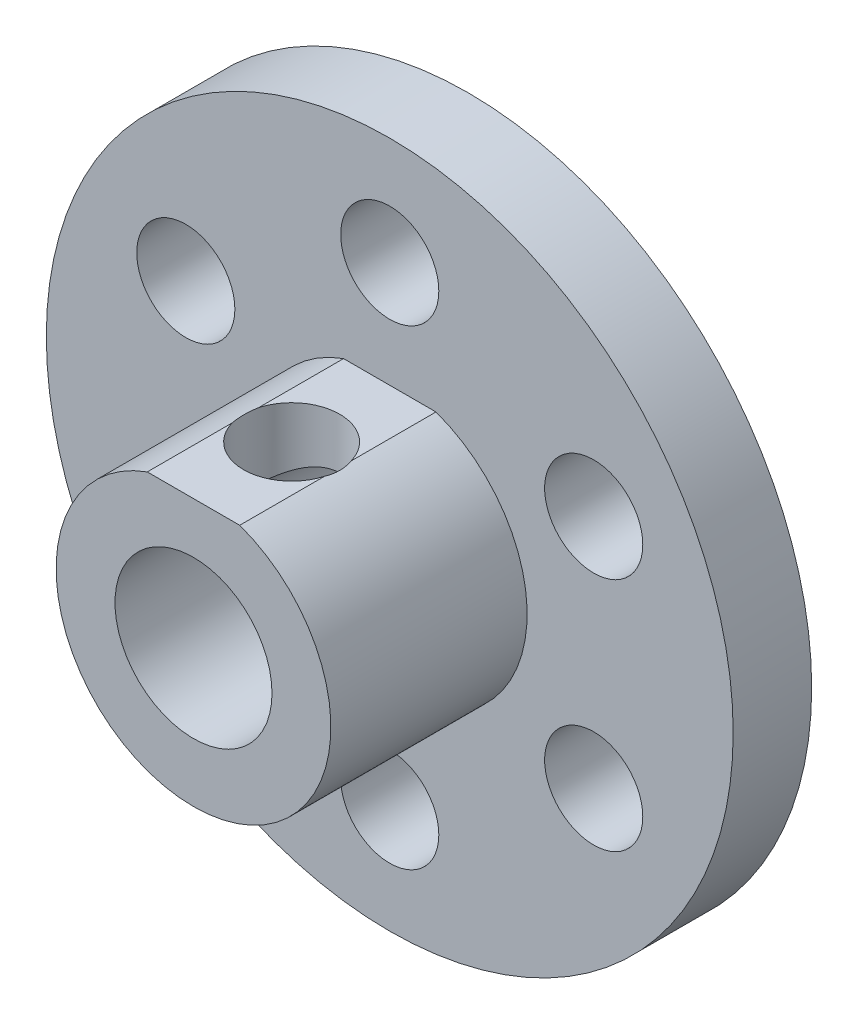
ISO-10303-21;
HEADER;
FILE_DESCRIPTION(('STEP AP214'),'2;1');
FILE_NAME('part.step','',(''),(''),'','','');
FILE_SCHEMA(('AUTOMOTIVE_DESIGN { 1 0 10303 214 1 1 1 1 }'));
ENDSEC;
DATA;
#1=APPLICATION_CONTEXT('core data for automotive mechanical design processes');
#2=APPLICATION_PROTOCOL_DEFINITION('international standard','automotive_design',2000,#1);
#3=PRODUCT_CONTEXT('',#1,'mechanical');
#4=PRODUCT('Part','Part','',(#3));
#5=PRODUCT_RELATED_PRODUCT_CATEGORY('part','',(#4));
#6=PRODUCT_DEFINITION_FORMATION('','',#4);
#7=PRODUCT_DEFINITION_CONTEXT('part definition',#1,'design');
#8=PRODUCT_DEFINITION('design','',#6,#7);
#9=PRODUCT_DEFINITION_SHAPE('','',#8);
#10=(LENGTH_UNIT() NAMED_UNIT(*) SI_UNIT(.MILLI.,.METRE.));
#11=(NAMED_UNIT(*) PLANE_ANGLE_UNIT() SI_UNIT($,.RADIAN.));
#12=(NAMED_UNIT(*) SI_UNIT($,.STERADIAN.) SOLID_ANGLE_UNIT());
#13=UNCERTAINTY_MEASURE_WITH_UNIT(LENGTH_MEASURE(1.E-05),#10,'distance_accuracy_value','');
#14=(GEOMETRIC_REPRESENTATION_CONTEXT(3) GLOBAL_UNCERTAINTY_ASSIGNED_CONTEXT((#13)) GLOBAL_UNIT_ASSIGNED_CONTEXT((#10,
#11,#12)) REPRESENTATION_CONTEXT('',''));
#15=CARTESIAN_POINT('',(0.,0.,0.));
#16=DIRECTION('',(0.,0.,1.));
#17=DIRECTION('',(1.,0.,0.));
#18=AXIS2_PLACEMENT_3D('',#15,#16,#17);
#19=CARTESIAN_POINT('',(2.35510577368301,6.59192512053687,14.));
#20=DIRECTION('',(0.,-1.,0.));
#21=DIRECTION('',(0.,0.,-1.));
#22=AXIS2_PLACEMENT_3D('',#19,#20,#21);
#23=PLANE('',#22);
#24=DIRECTION('',(0.,0.,-1.));
#25=VECTOR('',#24,1.);
#26=CARTESIAN_POINT('',(2.35510577368301,6.59192512053687,14.));
#27=LINE('',#26,#25);
#28=CARTESIAN_POINT('',(2.35510577368301,6.59192512053687,14.));
#29=VERTEX_POINT('',#28);
#30=CARTESIAN_POINT('',(2.35510577368301,6.59192512053687,9.67526053843311));
#31=VERTEX_POINT('',#30);
#32=EDGE_CURVE('E90',#29,#31,#27,.T.);
#33=ORIENTED_EDGE('',*,*,#32,.T.);
#34=CARTESIAN_POINT('',(0.,6.59192512053687,9.));
#35=DIRECTION('',(0.,-1.,0.));
#36=DIRECTION('',(0.,0.,-1.));
#37=AXIS2_PLACEMENT_3D('',#34,#35,#36);
#38=CIRCLE('',#37,2.45);
#39=CARTESIAN_POINT('',(-2.35510577368301,6.59192512053687,9.67526053843311));
#40=VERTEX_POINT('',#39);
#41=EDGE_CURVE('E11',#31,#40,#38,.T.);
#42=ORIENTED_EDGE('',*,*,#41,.T.);
#43=DIRECTION('',(0.,0.,-1.));
#44=VECTOR('',#43,1.);
#45=CARTESIAN_POINT('',(-2.35510577368301,6.59192512053687,14.));
#46=LINE('',#45,#44);
#47=CARTESIAN_POINT('',(-2.35510577368301,6.59192512053687,14.));
#48=VERTEX_POINT('',#47);
#49=EDGE_CURVE('E103',#48,#40,#46,.T.);
#50=ORIENTED_EDGE('',*,*,#49,.F.);
#51=DIRECTION('',(-1.,0.,0.));
#52=VECTOR('',#51,1.);
#53=CARTESIAN_POINT('',(2.35510577368301,6.59192512053687,14.));
#54=LINE('',#53,#52);
#55=EDGE_CURVE('E93',#29,#48,#54,.T.);
#56=ORIENTED_EDGE('',*,*,#55,.F.);
#57=EDGE_LOOP('',(#33,#42,#50,#56));
#58=FACE_BOUND('',#57,.T.);
#59=ADVANCED_FACE('F39',(#58),#23,.F.);
#60=CARTESIAN_POINT('',(0.,0.,4.));
#61=DIRECTION('',(0.,0.,1.));
#62=DIRECTION('',(1.,0.,0.));
#63=AXIS2_PLACEMENT_3D('',#60,#61,#62);
#64=PLANE('',#63);
#65=CARTESIAN_POINT('',(-10.3923048454133,6.,4.));
#66=DIRECTION('',(0.,0.,1.));
#67=DIRECTION('',(1.,0.,0.));
#68=AXIS2_PLACEMENT_3D('',#65,#66,#67);
#69=CIRCLE('',#68,2.5);
#70=CARTESIAN_POINT('',(-7.89230484541326,6.,4.));
#71=VERTEX_POINT('',#70);
#72=EDGE_CURVE('E101',#71,#71,#69,.T.);
#73=ORIENTED_EDGE('',*,*,#72,.F.);
#74=EDGE_LOOP('',(#73));
#75=FACE_BOUND('',#74,.T.);
#76=CARTESIAN_POINT('',(0.,-12.,4.));
#77=DIRECTION('',(0.,0.,1.));
#78=DIRECTION('',(1.,0.,0.));
#79=AXIS2_PLACEMENT_3D('',#76,#77,#78);
#80=CIRCLE('',#79,2.5);
#81=CARTESIAN_POINT('',(2.5,-12.,4.));
#82=VERTEX_POINT('',#81);
#83=EDGE_CURVE('E119',#82,#82,#80,.T.);
#84=ORIENTED_EDGE('',*,*,#83,.F.);
#85=EDGE_LOOP('',(#84));
#86=FACE_BOUND('',#85,.T.);
#87=CARTESIAN_POINT('',(10.3923048454133,6.,4.));
#88=DIRECTION('',(0.,0.,1.));
#89=DIRECTION('',(1.,0.,0.));
#90=AXIS2_PLACEMENT_3D('',#87,#88,#89);
#91=CIRCLE('',#90,2.50000000000003);
#92=CARTESIAN_POINT('',(12.8923048454133,6.,4.));
#93=VERTEX_POINT('',#92);
#94=EDGE_CURVE('E135',#93,#93,#91,.T.);
#95=ORIENTED_EDGE('',*,*,#94,.F.);
#96=EDGE_LOOP('',(#95));
#97=FACE_BOUND('',#96,.T.);
#98=CARTESIAN_POINT('',(0.,12.,4.));
#99=DIRECTION('',(0.,0.,1.));
#100=DIRECTION('',(1.,0.,0.));
#101=AXIS2_PLACEMENT_3D('',#98,#99,#100);
#102=CIRCLE('',#101,2.5);
#103=CARTESIAN_POINT('',(2.50000000000001,12.,4.));
#104=VERTEX_POINT('',#103);
#105=EDGE_CURVE('E147',#104,#104,#102,.T.);
#106=ORIENTED_EDGE('',*,*,#105,.F.);
#107=EDGE_LOOP('',(#106));
#108=FACE_BOUND('',#107,.T.);
#109=CARTESIAN_POINT('',(0.,0.,4.));
#110=DIRECTION('',(0.,0.,1.));
#111=DIRECTION('',(1.,0.,0.));
#112=AXIS2_PLACEMENT_3D('',#109,#110,#111);
#113=CIRCLE('',#112,17.5);
#114=CARTESIAN_POINT('',(17.5,0.,4.));
#115=VERTEX_POINT('',#114);
#116=EDGE_CURVE('E155',#115,#115,#113,.T.);
#117=ORIENTED_EDGE('',*,*,#116,.T.);
#118=EDGE_LOOP('',(#117));
#119=FACE_BOUND('',#118,.T.);
#120=CARTESIAN_POINT('',(10.3923048454133,-6.,4.));
#121=DIRECTION('',(0.,0.,1.));
#122=DIRECTION('',(1.,0.,0.));
#123=AXIS2_PLACEMENT_3D('',#120,#121,#122);
#124=CIRCLE('',#123,2.50000000000005);
#125=CARTESIAN_POINT('',(12.8923048454133,-6.,4.));
#126=VERTEX_POINT('',#125);
#127=EDGE_CURVE('E127',#126,#126,#124,.T.);
#128=ORIENTED_EDGE('',*,*,#127,.F.);
#129=EDGE_LOOP('',(#128));
#130=FACE_BOUND('',#129,.T.);
#131=CARTESIAN_POINT('',(-10.3923048454133,-6.,4.));
#132=DIRECTION('',(0.,0.,1.));
#133=DIRECTION('',(1.,0.,0.));
#134=AXIS2_PLACEMENT_3D('',#131,#132,#133);
#135=CIRCLE('',#134,2.5);
#136=CARTESIAN_POINT('',(-7.89230484541326,-6.,4.));
#137=VERTEX_POINT('',#136);
#138=EDGE_CURVE('E111',#137,#137,#135,.T.);
#139=ORIENTED_EDGE('',*,*,#138,.F.);
#140=EDGE_LOOP('',(#139));
#141=FACE_BOUND('',#140,.T.);
#142=DIRECTION('',(-1.,0.,0.));
#143=VECTOR('',#142,1.);
#144=CARTESIAN_POINT('',(2.35510577368301,6.59192512053687,4.));
#145=LINE('',#144,#143);
#146=CARTESIAN_POINT('',(2.35510577368301,6.59192512053687,4.));
#147=VERTEX_POINT('',#146);
#148=CARTESIAN_POINT('',(-2.35510577368301,6.59192512053687,4.));
#149=VERTEX_POINT('',#148);
#150=EDGE_CURVE('E215',#147,#149,#145,.T.);
#151=ORIENTED_EDGE('',*,*,#150,.F.);
#152=CARTESIAN_POINT('',(0.,0.,4.));
#153=DIRECTION('',(0.,0.,1.));
#154=DIRECTION('',(1.,0.,0.));
#155=AXIS2_PLACEMENT_3D('',#152,#153,#154);
#156=CIRCLE('',#155,7.);
#157=EDGE_CURVE('E226',#149,#147,#156,.T.);
#158=ORIENTED_EDGE('',*,*,#157,.F.);
#159=EDGE_LOOP('',(#151,#158));
#160=FACE_BOUND('',#159,.T.);
#161=ADVANCED_FACE('F166',(#75,#86,#97,#108,#119,#130,#141,#160),#64,.T.);
#162=CARTESIAN_POINT('',(0.,0.,0.));
#163=DIRECTION('',(0.,0.,1.));
#164=DIRECTION('',(1.,0.,0.));
#165=AXIS2_PLACEMENT_3D('',#162,#163,#164);
#166=PLANE('',#165);
#167=CARTESIAN_POINT('',(0.,0.,0.));
#168=DIRECTION('',(0.,0.,1.));
#169=DIRECTION('',(1.,0.,0.));
#170=AXIS2_PLACEMENT_3D('',#167,#168,#169);
#171=CIRCLE('',#170,17.5);
#172=CARTESIAN_POINT('',(17.5,0.,0.));
#173=VERTEX_POINT('',#172);
#174=EDGE_CURVE('E151',#173,#173,#171,.T.);
#175=ORIENTED_EDGE('',*,*,#174,.F.);
#176=EDGE_LOOP('',(#175));
#177=FACE_BOUND('',#176,.T.);
#178=CARTESIAN_POINT('',(0.,12.,0.));
#179=DIRECTION('',(0.,0.,1.));
#180=DIRECTION('',(1.,0.,0.));
#181=AXIS2_PLACEMENT_3D('',#178,#179,#180);
#182=CIRCLE('',#181,2.5);
#183=CARTESIAN_POINT('',(2.50000000000001,12.,0.));
#184=VERTEX_POINT('',#183);
#185=EDGE_CURVE('E146',#184,#184,#182,.T.);
#186=ORIENTED_EDGE('',*,*,#185,.T.);
#187=EDGE_LOOP('',(#186));
#188=FACE_BOUND('',#187,.T.);
#189=CARTESIAN_POINT('',(0.,0.,0.));
#190=DIRECTION('',(0.,0.,1.));
#191=DIRECTION('',(1.,0.,0.));
#192=AXIS2_PLACEMENT_3D('',#189,#190,#191);
#193=CIRCLE('',#192,4.);
#194=CARTESIAN_POINT('',(4.,0.,0.));
#195=VERTEX_POINT('',#194);
#196=EDGE_CURVE('E139',#195,#195,#193,.T.);
#197=ORIENTED_EDGE('',*,*,#196,.T.);
#198=EDGE_LOOP('',(#197));
#199=FACE_BOUND('',#198,.T.);
#200=CARTESIAN_POINT('',(10.3923048454133,6.,0.));
#201=DIRECTION('',(0.,0.,1.));
#202=DIRECTION('',(1.,0.,0.));
#203=AXIS2_PLACEMENT_3D('',#200,#201,#202);
#204=CIRCLE('',#203,2.50000000000003);
#205=CARTESIAN_POINT('',(12.8923048454133,6.,0.));
#206=VERTEX_POINT('',#205);
#207=EDGE_CURVE('E131',#206,#206,#204,.T.);
#208=ORIENTED_EDGE('',*,*,#207,.T.);
#209=EDGE_LOOP('',(#208));
#210=FACE_BOUND('',#209,.T.);
#211=CARTESIAN_POINT('',(10.3923048454133,-6.,0.));
#212=DIRECTION('',(0.,0.,1.));
#213=DIRECTION('',(1.,0.,0.));
#214=AXIS2_PLACEMENT_3D('',#211,#212,#213);
#215=CIRCLE('',#214,2.50000000000005);
#216=CARTESIAN_POINT('',(12.8923048454133,-6.,0.));
#217=VERTEX_POINT('',#216);
#218=EDGE_CURVE('E123',#217,#217,#215,.T.);
#219=ORIENTED_EDGE('',*,*,#218,.T.);
#220=EDGE_LOOP('',(#219));
#221=FACE_BOUND('',#220,.T.);
#222=CARTESIAN_POINT('',(0.,-12.,0.));
#223=DIRECTION('',(0.,0.,1.));
#224=DIRECTION('',(1.,0.,0.));
#225=AXIS2_PLACEMENT_3D('',#222,#223,#224);
#226=CIRCLE('',#225,2.5);
#227=CARTESIAN_POINT('',(2.5,-12.,0.));
#228=VERTEX_POINT('',#227);
#229=EDGE_CURVE('E115',#228,#228,#226,.T.);
#230=ORIENTED_EDGE('',*,*,#229,.T.);
#231=EDGE_LOOP('',(#230));
#232=FACE_BOUND('',#231,.T.);
#233=CARTESIAN_POINT('',(-10.3923048454133,-6.,0.));
#234=DIRECTION('',(0.,0.,1.));
#235=DIRECTION('',(1.,0.,0.));
#236=AXIS2_PLACEMENT_3D('',#233,#234,#235);
#237=CIRCLE('',#236,2.5);
#238=CARTESIAN_POINT('',(-7.89230484541326,-6.,0.));
#239=VERTEX_POINT('',#238);
#240=EDGE_CURVE('E109',#239,#239,#237,.T.);
#241=ORIENTED_EDGE('',*,*,#240,.T.);
#242=EDGE_LOOP('',(#241));
#243=FACE_BOUND('',#242,.T.);
#244=CARTESIAN_POINT('',(-10.3923048454133,6.,0.));
#245=DIRECTION('',(0.,0.,1.));
#246=DIRECTION('',(1.,0.,0.));
#247=AXIS2_PLACEMENT_3D('',#244,#245,#246);
#248=CIRCLE('',#247,2.5);
#249=CARTESIAN_POINT('',(-7.89230484541326,6.,0.));
#250=VERTEX_POINT('',#249);
#251=EDGE_CURVE('E96',#250,#250,#248,.T.);
#252=ORIENTED_EDGE('',*,*,#251,.T.);
#253=EDGE_LOOP('',(#252));
#254=FACE_BOUND('',#253,.T.);
#255=ADVANCED_FACE('F163',(#177,#188,#199,#210,#221,#232,#243,#254),#166,.F.);
#256=CARTESIAN_POINT('',(0.,0.,4.));
#257=DIRECTION('',(0.,0.,-1.));
#258=DIRECTION('',(-1.,0.,0.));
#259=AXIS2_PLACEMENT_3D('',#256,#257,#258);
#260=CYLINDRICAL_SURFACE('',#259,17.5);
#261=ORIENTED_EDGE('',*,*,#116,.F.);
#262=EDGE_LOOP('',(#261));
#263=FACE_BOUND('',#262,.T.);
#264=ORIENTED_EDGE('',*,*,#174,.T.);
#265=EDGE_LOOP('',(#264));
#266=FACE_BOUND('',#265,.T.);
#267=ADVANCED_FACE('F41',(#263,#266),#260,.T.);
#268=CARTESIAN_POINT('',(0.,12.,4.));
#269=DIRECTION('',(0.,0.,-1.));
#270=DIRECTION('',(-1.,0.,0.));
#271=AXIS2_PLACEMENT_3D('',#268,#269,#270);
#272=CYLINDRICAL_SURFACE('',#271,2.5);
#273=ORIENTED_EDGE('',*,*,#105,.T.);
#274=EDGE_LOOP('',(#273));
#275=FACE_BOUND('',#274,.T.);
#276=ORIENTED_EDGE('',*,*,#185,.F.);
#277=EDGE_LOOP('',(#276));
#278=FACE_BOUND('',#277,.T.);
#279=ADVANCED_FACE('F261',(#275,#278),#272,.F.);
#280=CARTESIAN_POINT('',(0.,0.,4.));
#281=DIRECTION('',(0.,0.,-1.));
#282=DIRECTION('',(-1.,0.,0.));
#283=AXIS2_PLACEMENT_3D('',#280,#281,#282);
#284=CYLINDRICAL_SURFACE('',#283,4.);
#285=CARTESIAN_POINT('',(0.,4.,11.45));
#286=CARTESIAN_POINT('',(-0.124902124806942,3.99999147542271,11.4499906400865));
#287=CARTESIAN_POINT('',(-0.249983723213845,3.99408670046503,11.4403819999197));
#288=CARTESIAN_POINT('',(-0.496345604352282,3.97102427492622,11.4024470082243));
#289=CARTESIAN_POINT('',(-0.617616940718776,3.95384195316891,11.37407961834));
#290=CARTESIAN_POINT('',(-0.852289239378917,3.90995968102998,11.3002520115141));
#291=CARTESIAN_POINT('',(-0.965725970813456,3.88330694783387,11.2548765322774));
#292=CARTESIAN_POINT('',(-1.18300107011276,3.8227278364809,11.1488687029989));
#293=CARTESIAN_POINT('',(-1.28684114542151,3.78880275580469,11.0882390741595));
#294=CARTESIAN_POINT('',(-1.49116296697679,3.71338091432746,10.9481926153646));
#295=CARTESIAN_POINT('',(-1.59074713021435,3.67149951338901,10.8676774125231));
#296=CARTESIAN_POINT('',(-1.77587240359007,3.58562615620903,10.6926418107774));
#297=CARTESIAN_POINT('',(-1.86139475801065,3.54163148066616,10.5981030215618));
#298=CARTESIAN_POINT('',(-2.02717520087132,3.44973112759623,10.383389325143));
#299=CARTESIAN_POINT('',(-2.1053320425597,3.4020527682807,10.2614806253675));
#300=CARTESIAN_POINT('',(-2.23978560633281,3.31508594687419,10.0034593008424));
#301=CARTESIAN_POINT('',(-2.29611859549014,3.27578361476288,9.86737072219254));
#302=CARTESIAN_POINT('',(-2.37297914140902,3.2203462162709,9.61954030558344));
#303=CARTESIAN_POINT('',(-2.39894015606915,3.20087439098818,9.51023404113479));
#304=CARTESIAN_POINT('',(-2.43564284771794,3.17304176206975,9.2877680087114));
#305=CARTESIAN_POINT('',(-2.44640470149308,3.1646662290958,9.17461355404828));
#306=CARTESIAN_POINT('',(-2.45207592735064,3.1602754741507,8.94740116634571));
#307=CARTESIAN_POINT('',(-2.44694924308606,3.16428836553102,8.83334176509778));
#308=CARTESIAN_POINT('',(-2.4211023457798,3.18410306085629,8.60802261382546));
#309=CARTESIAN_POINT('',(-2.40036999984047,3.1999140373482,8.49676511177708));
#310=CARTESIAN_POINT('',(-2.34495549060264,3.24072933836582,8.28180570658554));
#311=CARTESIAN_POINT('',(-2.31052577508889,3.26556662432266,8.17800516198811));
#312=CARTESIAN_POINT('',(-2.22902283876353,3.32173163815696,7.97740859895032));
#313=CARTESIAN_POINT('',(-2.18194507024645,3.35306169963396,7.88061511587559));
#314=CARTESIAN_POINT('',(-2.06668050308313,3.42552995416345,7.67816480382735));
#315=CARTESIAN_POINT('',(-1.99621551311672,3.46741710083153,7.57407329200419));
#316=CARTESIAN_POINT('',(-1.84053043605042,3.55251028904524,7.37807819695119));
#317=CARTESIAN_POINT('',(-1.75529567154884,3.5957176069875,7.28618689960845));
#318=CARTESIAN_POINT('',(-1.55719269322121,3.68629151249873,7.1030259310535));
#319=CARTESIAN_POINT('',(-1.44209385185602,3.73329406949963,7.013967367161));
#320=CARTESIAN_POINT('',(-1.19565703515989,3.81933926885152,6.85659316302477));
#321=CARTESIAN_POINT('',(-1.06432675633926,3.85838566071447,6.7882677443836));
#322=CARTESIAN_POINT('',(-0.861904974980945,3.90660932690952,6.7055404167389));
#323=CARTESIAN_POINT('',(-0.79568710581103,3.92066227628375,6.68173050706757));
#324=CARTESIAN_POINT('',(-0.660918525533698,3.94561384712634,6.63977614085934));
#325=CARTESIAN_POINT('',(-0.592369165946639,3.95651426236883,6.62162846207978));
#326=CARTESIAN_POINT('',(-0.453558672876573,3.97481822238362,6.59130197835029));
#327=CARTESIAN_POINT('',(-0.383298977533942,3.98222460511873,6.57911832892487));
#328=CARTESIAN_POINT('',(-0.241722211967342,3.99332230460538,6.56090754458397));
#329=CARTESIAN_POINT('',(-0.170405307497246,3.99701419760863,6.55487945471638));
#330=CARTESIAN_POINT('',(0.0237064620960952,4.00180003077637,6.54705454126524));
#331=CARTESIAN_POINT('',(0.146915450704388,3.99915941074319,6.55134787495379));
#332=CARTESIAN_POINT('',(0.39047650688581,3.98277079952243,6.57820965215524));
#333=CARTESIAN_POINT('',(0.510828694329406,3.96902327522808,6.60077732748242));
#334=CARTESIAN_POINT('',(0.741697427439616,3.93231785273932,6.66200909556241));
#335=CARTESIAN_POINT('',(0.85240417537481,3.90966282791557,6.70014531331625));
#336=CARTESIAN_POINT('',(1.06577390138656,3.85697047573955,6.79090881520879));
#337=CARTESIAN_POINT('',(1.16843541733522,3.82693181058046,6.84353872559924));
#338=CARTESIAN_POINT('',(1.37422692061352,3.75824979007965,6.96778525298279));
#339=CARTESIAN_POINT('',(1.47632292793061,3.7190396433139,7.04079642063557));
#340=CARTESIAN_POINT('',(1.66756244163872,3.63731712062616,7.20074846661613));
#341=CARTESIAN_POINT('',(1.75669088738293,3.59480099162867,7.28770529911945));
#342=CARTESIAN_POINT('',(1.93217328118956,3.50396225706217,7.4869920115993));
#343=CARTESIAN_POINT('',(2.01644737783445,3.45564795013552,7.60116734656011));
#344=CARTESIAN_POINT('',(2.16480496310801,3.36469873033318,7.84400801568629));
#345=CARTESIAN_POINT('',(2.22890633060781,3.32205880776966,7.97266038092208));
#346=CARTESIAN_POINT('',(2.32306405258437,3.25667550198216,8.21335833204095));
#347=CARTESIAN_POINT('',(2.35747009874831,3.23162708571952,8.32306806828502));
#348=CARTESIAN_POINT('',(2.41070355301573,3.19211948192797,8.54798546001093));
#349=CARTESIAN_POINT('',(2.42955405690482,3.17764459923471,8.66318469508088));
#350=CARTESIAN_POINT('',(2.45062929639344,3.16142556985537,8.89657602878204));
#351=CARTESIAN_POINT('',(2.45277610621048,3.1597410936294,9.01477957714563));
#352=CARTESIAN_POINT('',(2.44007881955711,3.1695535484447,9.24974014663766));
#353=CARTESIAN_POINT('',(2.42522693804413,3.18105651906284,9.3664964802095));
#354=CARTESIAN_POINT('',(2.38097439086499,3.21428833867748,9.58769448582533));
#355=CARTESIAN_POINT('',(2.35256122641842,3.23531878286792,9.69244676606415));
#356=CARTESIAN_POINT('',(2.2829281156136,3.28482221064683,9.89570894731532));
#357=CARTESIAN_POINT('',(2.24170318497702,3.31329809011561,9.99421640085716));
#358=CARTESIAN_POINT('',(2.14053199050973,3.37968952951631,10.1981041512198));
#359=CARTESIAN_POINT('',(2.07870378330941,3.41838051739289,10.3022942907842));
#360=CARTESIAN_POINT('',(1.94099485577325,3.49841229893376,10.4998518283309));
#361=CARTESIAN_POINT('',(1.86510250947168,3.53975526620441,10.5932101677411));
#362=CARTESIAN_POINT('',(1.68539506118721,3.62922259404205,10.7838359669124));
#363=CARTESIAN_POINT('',(1.57901235684898,3.67722182701973,10.878759322428));
#364=CARTESIAN_POINT('',(1.34959272749497,3.76745897286183,11.0497610363672));
#365=CARTESIAN_POINT('',(1.22654786022793,3.80969411879911,11.1258303585124));
#366=CARTESIAN_POINT('',(1.0326077233668,3.86499469545257,11.2229179447203));
#367=CARTESIAN_POINT('',(0.966903648133014,3.88199220328453,11.2522927977356));
#368=CARTESIAN_POINT('',(0.832565491253212,3.91300047351749,11.3053283829998));
#369=CARTESIAN_POINT('',(0.763933140116422,3.92701297139743,11.3289924365655));
#370=CARTESIAN_POINT('',(0.624471282286209,3.95158672548924,11.3701918745856));
#371=CARTESIAN_POINT('',(0.553648589510775,3.96215769683513,11.3877445209339));
#372=CARTESIAN_POINT('',(0.410314788079504,3.97955336672579,11.4165009573539));
#373=CARTESIAN_POINT('',(0.337805053555185,3.98638101011249,11.4277097383117));
#374=CARTESIAN_POINT('',(0.220920118014542,3.99413728756145,11.4404192415357));
#375=CARTESIAN_POINT('',(0.176844307312097,3.99633237440941,11.4440085485145));
#376=CARTESIAN_POINT('',(0.0885198531325888,3.999265280742,11.4488006509979));
#377=CARTESIAN_POINT('',(0.0442712004492618,4.00000302151201,11.4500033175945));
#378=CARTESIAN_POINT('',(0.,4.,11.45));
#379=B_SPLINE_CURVE_WITH_KNOTS('',3,(#285,#286,#287,#288,#289,#290,#291,#292,#293,#294,#295,
#296,#297,#298,#299,#300,#301,#302,#303,#304,#305,#306,#307,#308,#309,#310,#311,#312,#313,#314,
#315,#316,#317,#318,#319,#320,#321,#322,#323,#324,#325,#326,#327,#328,#329,#330,#331,#332,#333,
#334,#335,#336,#337,#338,#339,#340,#341,#342,#343,#344,#345,#346,#347,#348,#349,#350,#351,#352,
#353,#354,#355,#356,#357,#358,#359,#360,#361,#362,#363,#364,#365,#366,#367,#368,#369,#370,#371,
#372,#373,#374,#375,#376,#377,#378),.UNSPECIFIED.,.T.,.F.,(4,2,2,2,2,2,2,2,2,2,2,2,2,2,2,2,2,2,
2,2,2,2,2,2,2,2,2,2,2,2,2,2,2,2,2,2,2,2,2,2,2,2,2,2,2,2,4),(0.,0.374527585364465,
0.749877244217956,1.12338116966955,1.4968185125793,1.89945779243794,2.30262983310809,
2.75779600206234,3.21220249354628,3.55283367310981,3.89301224061911,4.23396335060577,
4.57517981320919,4.91037903653193,5.24569894500701,5.64169294062633,6.03808273432116,
6.4946343692164,6.95097034426256,7.16597215250573,7.380851384162,7.59555578238771,
7.81022686705711,8.17810516449857,8.54596799849965,8.90227580872194,9.25864822431674,
9.65160783448313,10.0450202495474,10.4927179527533,10.9400177415179,11.2916193787117,
11.6426980382262,11.9954135674814,12.348290697679,12.6786792667549,13.0091965311544,
13.3893593249626,13.7698377894219,14.2190954918881,14.6685680980562,14.8901427418625,
15.1115882088753,15.3324030218871,15.5530438717286,15.6857869322451,15.8185371623239),.UNSPECIFIED.);
#380=CARTESIAN_POINT('',(0.,4.,11.45));
#381=VERTEX_POINT('',#380);
#382=EDGE_CURVE('E233',#381,#381,#379,.T.);
#383=ORIENTED_EDGE('',*,*,#382,.F.);
#384=EDGE_LOOP('',(#383));
#385=FACE_BOUND('',#384,.T.);
#386=ORIENTED_EDGE('',*,*,#196,.F.);
#387=EDGE_LOOP('',(#386));
#388=FACE_BOUND('',#387,.T.);
#389=CARTESIAN_POINT('',(0.,0.,14.));
#390=DIRECTION('',(0.,0.,1.));
#391=DIRECTION('',(1.,0.,0.));
#392=AXIS2_PLACEMENT_3D('',#389,#390,#391);
#393=CIRCLE('',#392,4.);
#394=CARTESIAN_POINT('',(4.,0.,14.));
#395=VERTEX_POINT('',#394);
#396=EDGE_CURVE('E228',#395,#395,#393,.T.);
#397=ORIENTED_EDGE('',*,*,#396,.T.);
#398=EDGE_LOOP('',(#397));
#399=FACE_BOUND('',#398,.T.);
#400=ADVANCED_FACE('F255',(#385,#388,#399),#284,.F.);
#401=CARTESIAN_POINT('',(10.3923048454133,6.,4.));
#402=DIRECTION('',(0.,0.,-1.));
#403=DIRECTION('',(-1.,0.,0.));
#404=AXIS2_PLACEMENT_3D('',#401,#402,#403);
#405=CYLINDRICAL_SURFACE('',#404,2.50000000000003);
#406=ORIENTED_EDGE('',*,*,#94,.T.);
#407=EDGE_LOOP('',(#406));
#408=FACE_BOUND('',#407,.T.);
#409=ORIENTED_EDGE('',*,*,#207,.F.);
#410=EDGE_LOOP('',(#409));
#411=FACE_BOUND('',#410,.T.);
#412=ADVANCED_FACE('F260',(#408,#411),#405,.F.);
#413=CARTESIAN_POINT('',(10.3923048454133,-6.,4.));
#414=DIRECTION('',(0.,0.,-1.));
#415=DIRECTION('',(-1.,0.,0.));
#416=AXIS2_PLACEMENT_3D('',#413,#414,#415);
#417=CYLINDRICAL_SURFACE('',#416,2.50000000000005);
#418=ORIENTED_EDGE('',*,*,#127,.T.);
#419=EDGE_LOOP('',(#418));
#420=FACE_BOUND('',#419,.T.);
#421=ORIENTED_EDGE('',*,*,#218,.F.);
#422=EDGE_LOOP('',(#421));
#423=FACE_BOUND('',#422,.T.);
#424=ADVANCED_FACE('F282',(#420,#423),#417,.F.);
#425=CARTESIAN_POINT('',(0.,-12.,4.));
#426=DIRECTION('',(0.,0.,-1.));
#427=DIRECTION('',(-1.,0.,0.));
#428=AXIS2_PLACEMENT_3D('',#425,#426,#427);
#429=CYLINDRICAL_SURFACE('',#428,2.5);
#430=ORIENTED_EDGE('',*,*,#83,.T.);
#431=EDGE_LOOP('',(#430));
#432=FACE_BOUND('',#431,.T.);
#433=ORIENTED_EDGE('',*,*,#229,.F.);
#434=EDGE_LOOP('',(#433));
#435=FACE_BOUND('',#434,.T.);
#436=ADVANCED_FACE('F193',(#432,#435),#429,.F.);
#437=CARTESIAN_POINT('',(-10.3923048454133,-6.,4.));
#438=DIRECTION('',(0.,0.,-1.));
#439=DIRECTION('',(-1.,0.,0.));
#440=AXIS2_PLACEMENT_3D('',#437,#438,#439);
#441=CYLINDRICAL_SURFACE('',#440,2.5);
#442=ORIENTED_EDGE('',*,*,#138,.T.);
#443=EDGE_LOOP('',(#442));
#444=FACE_BOUND('',#443,.T.);
#445=ORIENTED_EDGE('',*,*,#240,.F.);
#446=EDGE_LOOP('',(#445));
#447=FACE_BOUND('',#446,.T.);
#448=ADVANCED_FACE('F184',(#444,#447),#441,.F.);
#449=CARTESIAN_POINT('',(-10.3923048454133,6.,4.));
#450=DIRECTION('',(0.,0.,-1.));
#451=DIRECTION('',(-1.,0.,0.));
#452=AXIS2_PLACEMENT_3D('',#449,#450,#451);
#453=CYLINDRICAL_SURFACE('',#452,2.5);
#454=ORIENTED_EDGE('',*,*,#72,.T.);
#455=EDGE_LOOP('',(#454));
#456=FACE_BOUND('',#455,.T.);
#457=ORIENTED_EDGE('',*,*,#251,.F.);
#458=EDGE_LOOP('',(#457));
#459=FACE_BOUND('',#458,.T.);
#460=ADVANCED_FACE('F181',(#456,#459),#453,.F.);
#461=CARTESIAN_POINT('',(0.,0.,14.));
#462=DIRECTION('',(0.,0.,1.));
#463=DIRECTION('',(1.,0.,0.));
#464=AXIS2_PLACEMENT_3D('',#461,#462,#463);
#465=PLANE('',#464);
#466=CARTESIAN_POINT('',(0.,0.,14.));
#467=DIRECTION('',(0.,0.,1.));
#468=DIRECTION('',(1.,0.,0.));
#469=AXIS2_PLACEMENT_3D('',#466,#467,#468);
#470=CIRCLE('',#469,7.);
#471=EDGE_CURVE('E220',#48,#29,#470,.T.);
#472=ORIENTED_EDGE('',*,*,#471,.T.);
#473=ORIENTED_EDGE('',*,*,#55,.T.);
#474=EDGE_LOOP('',(#472,#473));
#475=FACE_BOUND('',#474,.T.);
#476=ORIENTED_EDGE('',*,*,#396,.F.);
#477=EDGE_LOOP('',(#476));
#478=FACE_BOUND('',#477,.T.);
#479=ADVANCED_FACE('F183',(#475,#478),#465,.T.);
#480=CARTESIAN_POINT('',(0.,0.,14.));
#481=DIRECTION('',(0.,0.,-1.));
#482=DIRECTION('',(-1.,0.,0.));
#483=AXIS2_PLACEMENT_3D('',#480,#481,#482);
#484=CYLINDRICAL_SURFACE('',#483,7.);
#485=ORIENTED_EDGE('',*,*,#49,.T.);
#486=CARTESIAN_POINT('',(-2.35510577368301,6.59192512053687,9.67526053843311));
#487=CARTESIAN_POINT('',(-2.37320849201851,6.58545094805905,9.61215371002749));
#488=CARTESIAN_POINT('',(-2.38878249426906,6.57980896188825,9.54823223277634));
#489=CARTESIAN_POINT('',(-2.41476530536504,6.57032140168331,9.41920176085871));
#490=CARTESIAN_POINT('',(-2.42517288697684,6.56647625448374,9.35409248784703));
#491=CARTESIAN_POINT('',(-2.44051630864788,6.56078808173877,9.22476085726711));
#492=CARTESIAN_POINT('',(-2.44557983127471,6.55889835903275,9.16055579275917));
#493=CARTESIAN_POINT('',(-2.45063725162004,6.55701023635535,9.03194946794288));
#494=CARTESIAN_POINT('',(-2.45063263449195,6.55701128231849,8.96754827064053));
#495=CARTESIAN_POINT('',(-2.44424872503293,6.55939633127809,8.80617915457927));
#496=CARTESIAN_POINT('',(-2.43462450713692,6.56299351643359,8.70932721841086));
#497=CARTESIAN_POINT('',(-2.4115374687002,6.57149514784866,8.5647540706471));
#498=CARTESIAN_POINT('',(-2.40226935650579,6.57489425285552,8.51622337077156));
#499=CARTESIAN_POINT('',(-2.3808422575823,6.58268315681662,8.41989539127055));
#500=CARTESIAN_POINT('',(-2.36868387553588,6.5870727485382,8.37209796045916));
#501=CARTESIAN_POINT('',(-2.35510577368301,6.59192512053687,8.32473946156689));
#502=B_SPLINE_CURVE_WITH_KNOTS('',3,(#486,#487,#488,#489,#490,#491,#492,#493,#494,#495,#496,
#497,#498,#499,#500,#501),.UNSPECIFIED.,.F.,.F.,(4,2,2,2,2,2,2,4),(0.,0.197858543814748,
0.395764064564355,0.588826003186102,0.781831367495638,1.07311924770257,1.22160982420148,
1.37006936180716),.UNSPECIFIED.);
#503=CARTESIAN_POINT('',(-2.35510577368301,6.59192512053687,8.32473946156689));
#504=VERTEX_POINT('',#503);
#505=EDGE_CURVE('E81',#40,#504,#502,.T.);
#506=ORIENTED_EDGE('',*,*,#505,.T.);
#507=EDGE_CURVE('E213',#504,#149,#46,.T.);
#508=ORIENTED_EDGE('',*,*,#507,.T.);
#509=ORIENTED_EDGE('',*,*,#157,.T.);
#510=CARTESIAN_POINT('',(2.35510577368301,6.59192512053687,8.32473946156689));
#511=VERTEX_POINT('',#510);
#512=EDGE_CURVE('E62',#511,#147,#27,.T.);
#513=ORIENTED_EDGE('',*,*,#512,.F.);
#514=CARTESIAN_POINT('',(2.35510577368301,6.59192512053687,8.32473946156689));
#515=CARTESIAN_POINT('',(2.37320849201851,6.58545094805905,8.38784628997251));
#516=CARTESIAN_POINT('',(2.38878249426906,6.57980896188825,8.45176776722366));
#517=CARTESIAN_POINT('',(2.41476530536504,6.57032140168331,8.5807982391413));
#518=CARTESIAN_POINT('',(2.42517288697684,6.56647625448374,8.64590751215298));
#519=CARTESIAN_POINT('',(2.44051630864788,6.56078808173877,8.77523914273289));
#520=CARTESIAN_POINT('',(2.44557983127471,6.55889835903275,8.83944420724083));
#521=CARTESIAN_POINT('',(2.45063725162004,6.55701023635535,8.96805053205712));
#522=CARTESIAN_POINT('',(2.45063263449195,6.55701128231849,9.03245172935947));
#523=CARTESIAN_POINT('',(2.44424872503293,6.55939633127809,9.19382084542073));
#524=CARTESIAN_POINT('',(2.43462450713692,6.56299351643359,9.29067278158915));
#525=CARTESIAN_POINT('',(2.4115374687002,6.57149514784866,9.4352459293529));
#526=CARTESIAN_POINT('',(2.40226935650579,6.57489425285552,9.48377662922844));
#527=CARTESIAN_POINT('',(2.3808422575823,6.58268315681662,9.58010460872946));
#528=CARTESIAN_POINT('',(2.36868387553588,6.5870727485382,9.62790203954085));
#529=CARTESIAN_POINT('',(2.35510577368301,6.59192512053687,9.67526053843311));
#530=B_SPLINE_CURVE_WITH_KNOTS('',3,(#514,#515,#516,#517,#518,#519,#520,#521,#522,#523,#524,
#525,#526,#527,#528,#529),.UNSPECIFIED.,.F.,.F.,(4,2,2,2,2,2,2,4),(0.,0.197858543814748,
0.395764064564355,0.588826003186102,0.781831367495638,1.07311924770257,1.22160982420148,
1.37006936180716),.UNSPECIFIED.);
#531=EDGE_CURVE('E55',#511,#31,#530,.T.);
#532=ORIENTED_EDGE('',*,*,#531,.T.);
#533=ORIENTED_EDGE('',*,*,#32,.F.);
#534=ORIENTED_EDGE('',*,*,#471,.F.);
#535=EDGE_LOOP('',(#485,#506,#508,#509,#513,#532,#533,#534));
#536=FACE_BOUND('',#535,.T.);
#537=ADVANCED_FACE('F88',(#536),#484,.T.);
#538=ORIENTED_EDGE('',*,*,#507,.F.);
#539=EDGE_CURVE('E43',#504,#511,#38,.T.);
#540=ORIENTED_EDGE('',*,*,#539,.T.);
#541=ORIENTED_EDGE('',*,*,#512,.T.);
#542=ORIENTED_EDGE('',*,*,#150,.T.);
#543=EDGE_LOOP('',(#538,#540,#541,#542));
#544=FACE_BOUND('',#543,.T.);
#545=ADVANCED_FACE('F199',(#544),#23,.F.);
#546=CARTESIAN_POINT('',(0.,2.59192512053687,9.));
#547=DIRECTION('',(0.,1.,0.));
#548=DIRECTION('',(0.,0.,1.));
#549=AXIS2_PLACEMENT_3D('',#546,#547,#548);
#550=CYLINDRICAL_SURFACE('',#549,2.45);
#551=ORIENTED_EDGE('',*,*,#382,.T.);
#552=EDGE_LOOP('',(#551));
#553=FACE_BOUND('',#552,.T.);
#554=ORIENTED_EDGE('',*,*,#41,.F.);
#555=ORIENTED_EDGE('',*,*,#531,.F.);
#556=ORIENTED_EDGE('',*,*,#539,.F.);
#557=ORIENTED_EDGE('',*,*,#505,.F.);
#558=EDGE_LOOP('',(#554,#555,#556,#557));
#559=FACE_BOUND('',#558,.T.);
#560=ADVANCED_FACE('F79',(#553,#559),#550,.F.);
#561=CLOSED_SHELL('',(#59,#161,#255,#267,#279,#400,#412,#424,#436,#448,#460,#479,#537,#545,#560));
#562=MANIFOLD_SOLID_BREP('B2',#561);
#563=ADVANCED_BREP_SHAPE_REPRESENTATION('',(#18,#562),#14);
#564=SHAPE_DEFINITION_REPRESENTATION(#9,#563);
ENDSEC;
END-ISO-10303-21;
